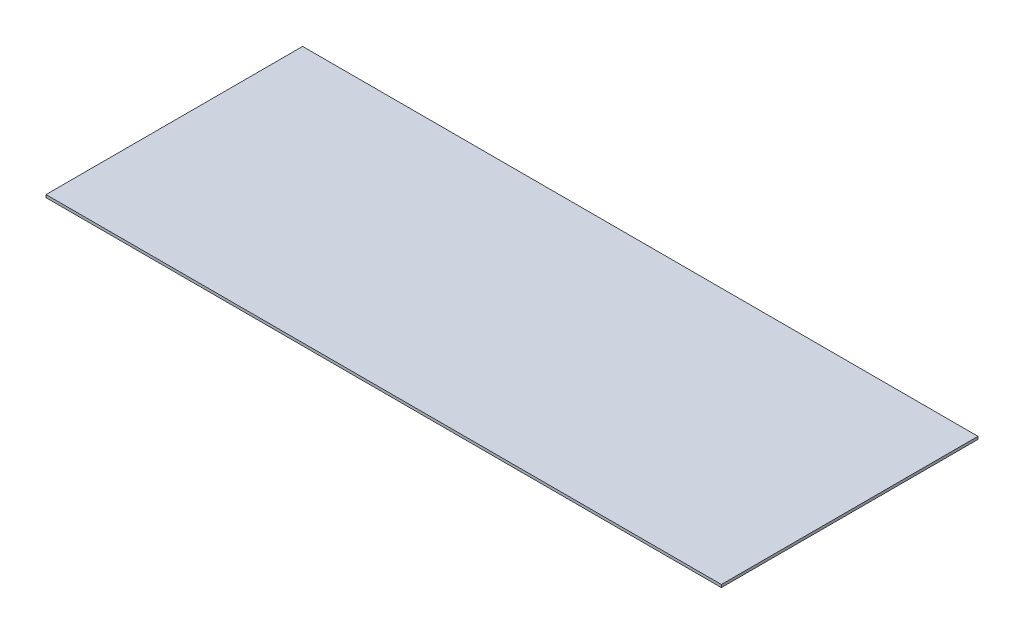
ISO-10303-21;
HEADER;
FILE_DESCRIPTION(('STEP AP214'),'2;1');
FILE_NAME('part.step','',(''),(''),'','','');
FILE_SCHEMA(('AUTOMOTIVE_DESIGN { 1 0 10303 214 1 1 1 1 }'));
ENDSEC;
DATA;
#1=APPLICATION_CONTEXT('core data for automotive mechanical design processes');
#2=APPLICATION_PROTOCOL_DEFINITION('international standard','automotive_design',2000,#1);
#3=PRODUCT_CONTEXT('',#1,'mechanical');
#4=PRODUCT('Part','Part','',(#3));
#5=PRODUCT_RELATED_PRODUCT_CATEGORY('part','',(#4));
#6=PRODUCT_DEFINITION_FORMATION('','',#4);
#7=PRODUCT_DEFINITION_CONTEXT('part definition',#1,'design');
#8=PRODUCT_DEFINITION('design','',#6,#7);
#9=PRODUCT_DEFINITION_SHAPE('','',#8);
#10=(LENGTH_UNIT() NAMED_UNIT(*) SI_UNIT(.MILLI.,.METRE.));
#11=(NAMED_UNIT(*) PLANE_ANGLE_UNIT() SI_UNIT($,.RADIAN.));
#12=(NAMED_UNIT(*) SI_UNIT($,.STERADIAN.) SOLID_ANGLE_UNIT());
#13=UNCERTAINTY_MEASURE_WITH_UNIT(LENGTH_MEASURE(1.E-05),#10,'distance_accuracy_value','');
#14=(GEOMETRIC_REPRESENTATION_CONTEXT(3) GLOBAL_UNCERTAINTY_ASSIGNED_CONTEXT((#13)) GLOBAL_UNIT_ASSIGNED_CONTEXT((#10,
#11,#12)) REPRESENTATION_CONTEXT('',''));
#15=CARTESIAN_POINT('',(0.,0.,0.));
#16=DIRECTION('',(0.,0.,1.));
#17=DIRECTION('',(1.,0.,0.));
#18=AXIS2_PLACEMENT_3D('',#15,#16,#17);
#19=CARTESIAN_POINT('',(-176.512287334594,2.,-119.092627599244));
#20=DIRECTION('',(1.,0.,0.));
#21=DIRECTION('',(0.,0.,-1.));
#22=AXIS2_PLACEMENT_3D('',#19,#20,#21);
#23=PLANE('',#22);
#24=DIRECTION('',(0.,0.,1.));
#25=VECTOR('',#24,1.);
#26=CARTESIAN_POINT('',(-176.512287334594,0.,-119.092627599244));
#27=LINE('',#26,#25);
#28=CARTESIAN_POINT('',(-176.512287334594,0.,-119.092627599244));
#29=VERTEX_POINT('',#28);
#30=CARTESIAN_POINT('',(-176.512287334594,0.,70.9073724007561));
#31=VERTEX_POINT('',#30);
#32=EDGE_CURVE('E113',#29,#31,#27,.T.);
#33=ORIENTED_EDGE('',*,*,#32,.T.);
#34=DIRECTION('',(0.,-1.,0.));
#35=VECTOR('',#34,1.);
#36=CARTESIAN_POINT('',(-176.512287334594,2.,70.9073724007561));
#37=LINE('',#36,#35);
#38=CARTESIAN_POINT('',(-176.512287334594,2.,70.9073724007561));
#39=VERTEX_POINT('',#38);
#40=EDGE_CURVE('E11',#39,#31,#37,.T.);
#41=ORIENTED_EDGE('',*,*,#40,.F.);
#42=DIRECTION('',(0.,0.,1.));
#43=VECTOR('',#42,1.);
#44=CARTESIAN_POINT('',(-176.512287334594,2.,-119.092627599244));
#45=LINE('',#44,#43);
#46=CARTESIAN_POINT('',(-176.512287334594,2.,-119.092627599244));
#47=VERTEX_POINT('',#46);
#48=EDGE_CURVE('E97',#47,#39,#45,.T.);
#49=ORIENTED_EDGE('',*,*,#48,.F.);
#50=DIRECTION('',(0.,-1.,0.));
#51=VECTOR('',#50,1.);
#52=CARTESIAN_POINT('',(-176.512287334594,2.,-119.092627599244));
#53=LINE('',#52,#51);
#54=EDGE_CURVE('E109',#47,#29,#53,.T.);
#55=ORIENTED_EDGE('',*,*,#54,.T.);
#56=EDGE_LOOP('',(#33,#41,#49,#55));
#57=FACE_BOUND('',#56,.T.);
#58=ADVANCED_FACE('F45',(#57),#23,.F.);
#59=CARTESIAN_POINT('',(-176.512287334594,2.,70.9073724007561));
#60=DIRECTION('',(0.,0.,-1.));
#61=DIRECTION('',(-1.,0.,0.));
#62=AXIS2_PLACEMENT_3D('',#59,#60,#61);
#63=PLANE('',#62);
#64=DIRECTION('',(1.,0.,0.));
#65=VECTOR('',#64,1.);
#66=CARTESIAN_POINT('',(-176.512287334594,0.,70.9073724007561));
#67=LINE('',#66,#65);
#68=CARTESIAN_POINT('',(323.487712665406,0.,70.9073724007561));
#69=VERTEX_POINT('',#68);
#70=EDGE_CURVE('E102',#31,#69,#67,.T.);
#71=ORIENTED_EDGE('',*,*,#70,.T.);
#72=DIRECTION('',(0.,-1.,0.));
#73=VECTOR('',#72,1.);
#74=CARTESIAN_POINT('',(323.487712665406,2.,70.9073724007561));
#75=LINE('',#74,#73);
#76=CARTESIAN_POINT('',(323.487712665406,2.,70.9073724007561));
#77=VERTEX_POINT('',#76);
#78=EDGE_CURVE('E54',#77,#69,#75,.T.);
#79=ORIENTED_EDGE('',*,*,#78,.F.);
#80=DIRECTION('',(1.,0.,0.));
#81=VECTOR('',#80,1.);
#82=CARTESIAN_POINT('',(-176.512287334594,2.,70.9073724007561));
#83=LINE('',#82,#81);
#84=EDGE_CURVE('E92',#39,#77,#83,.T.);
#85=ORIENTED_EDGE('',*,*,#84,.F.);
#86=ORIENTED_EDGE('',*,*,#40,.T.);
#87=EDGE_LOOP('',(#71,#79,#85,#86));
#88=FACE_BOUND('',#87,.T.);
#89=ADVANCED_FACE('F101',(#88),#63,.F.);
#90=CARTESIAN_POINT('',(323.487712665406,2.,-119.092627599244));
#91=DIRECTION('',(-1.,0.,0.));
#92=DIRECTION('',(0.,0.,1.));
#93=AXIS2_PLACEMENT_3D('',#90,#91,#92);
#94=PLANE('',#93);
#95=DIRECTION('',(0.,0.,-1.));
#96=VECTOR('',#95,1.);
#97=CARTESIAN_POINT('',(323.487712665406,0.,-119.092627599244));
#98=LINE('',#97,#96);
#99=CARTESIAN_POINT('',(323.487712665406,0.,-119.092627599244));
#100=VERTEX_POINT('',#99);
#101=EDGE_CURVE('E79',#69,#100,#98,.T.);
#102=ORIENTED_EDGE('',*,*,#101,.T.);
#103=DIRECTION('',(0.,-1.,0.));
#104=VECTOR('',#103,1.);
#105=CARTESIAN_POINT('',(323.487712665406,2.,-119.092627599244));
#106=LINE('',#105,#104);
#107=CARTESIAN_POINT('',(323.487712665406,2.,-119.092627599244));
#108=VERTEX_POINT('',#107);
#109=EDGE_CURVE('E104',#108,#100,#106,.T.);
#110=ORIENTED_EDGE('',*,*,#109,.F.);
#111=DIRECTION('',(0.,0.,-1.));
#112=VECTOR('',#111,1.);
#113=CARTESIAN_POINT('',(323.487712665406,2.,-119.092627599244));
#114=LINE('',#113,#112);
#115=EDGE_CURVE('E95',#77,#108,#114,.T.);
#116=ORIENTED_EDGE('',*,*,#115,.F.);
#117=ORIENTED_EDGE('',*,*,#78,.T.);
#118=EDGE_LOOP('',(#102,#110,#116,#117));
#119=FACE_BOUND('',#118,.T.);
#120=ADVANCED_FACE('F105',(#119),#94,.F.);
#121=CARTESIAN_POINT('',(-176.512287334594,2.,-119.092627599244));
#122=DIRECTION('',(0.,0.,1.));
#123=DIRECTION('',(1.,0.,0.));
#124=AXIS2_PLACEMENT_3D('',#121,#122,#123);
#125=PLANE('',#124);
#126=DIRECTION('',(-1.,0.,0.));
#127=VECTOR('',#126,1.);
#128=CARTESIAN_POINT('',(-176.512287334594,0.,-119.092627599244));
#129=LINE('',#128,#127);
#130=EDGE_CURVE('E85',#100,#29,#129,.T.);
#131=ORIENTED_EDGE('',*,*,#130,.T.);
#132=ORIENTED_EDGE('',*,*,#54,.F.);
#133=DIRECTION('',(-1.,0.,0.));
#134=VECTOR('',#133,1.);
#135=CARTESIAN_POINT('',(-176.512287334594,2.,-119.092627599244));
#136=LINE('',#135,#134);
#137=EDGE_CURVE('E62',#108,#47,#136,.T.);
#138=ORIENTED_EDGE('',*,*,#137,.F.);
#139=ORIENTED_EDGE('',*,*,#109,.T.);
#140=EDGE_LOOP('',(#131,#132,#138,#139));
#141=FACE_BOUND('',#140,.T.);
#142=ADVANCED_FACE('F126',(#141),#125,.F.);
#143=CARTESIAN_POINT('',(0.,2.,0.));
#144=DIRECTION('',(0.,1.,0.));
#145=DIRECTION('',(0.,0.,1.));
#146=AXIS2_PLACEMENT_3D('',#143,#144,#145);
#147=PLANE('',#146);
#148=ORIENTED_EDGE('',*,*,#48,.T.);
#149=ORIENTED_EDGE('',*,*,#84,.T.);
#150=ORIENTED_EDGE('',*,*,#115,.T.);
#151=ORIENTED_EDGE('',*,*,#137,.T.);
#152=EDGE_LOOP('',(#148,#149,#150,#151));
#153=FACE_BOUND('',#152,.T.);
#154=ADVANCED_FACE('F93',(#153),#147,.T.);
#155=CARTESIAN_POINT('',(0.,0.,0.));
#156=DIRECTION('',(0.,1.,0.));
#157=DIRECTION('',(0.,0.,1.));
#158=AXIS2_PLACEMENT_3D('',#155,#156,#157);
#159=PLANE('',#158);
#160=ORIENTED_EDGE('',*,*,#32,.F.);
#161=ORIENTED_EDGE('',*,*,#130,.F.);
#162=ORIENTED_EDGE('',*,*,#101,.F.);
#163=ORIENTED_EDGE('',*,*,#70,.F.);
#164=EDGE_LOOP('',(#160,#161,#162,#163));
#165=FACE_BOUND('',#164,.T.);
#166=ADVANCED_FACE('F129',(#165),#159,.F.);
#167=CLOSED_SHELL('',(#58,#89,#120,#142,#154,#166));
#168=MANIFOLD_SOLID_BREP('B2',#167);
#169=ADVANCED_BREP_SHAPE_REPRESENTATION('',(#18,#168),#14);
#170=SHAPE_DEFINITION_REPRESENTATION(#9,#169);
ENDSEC;
END-ISO-10303-21;
